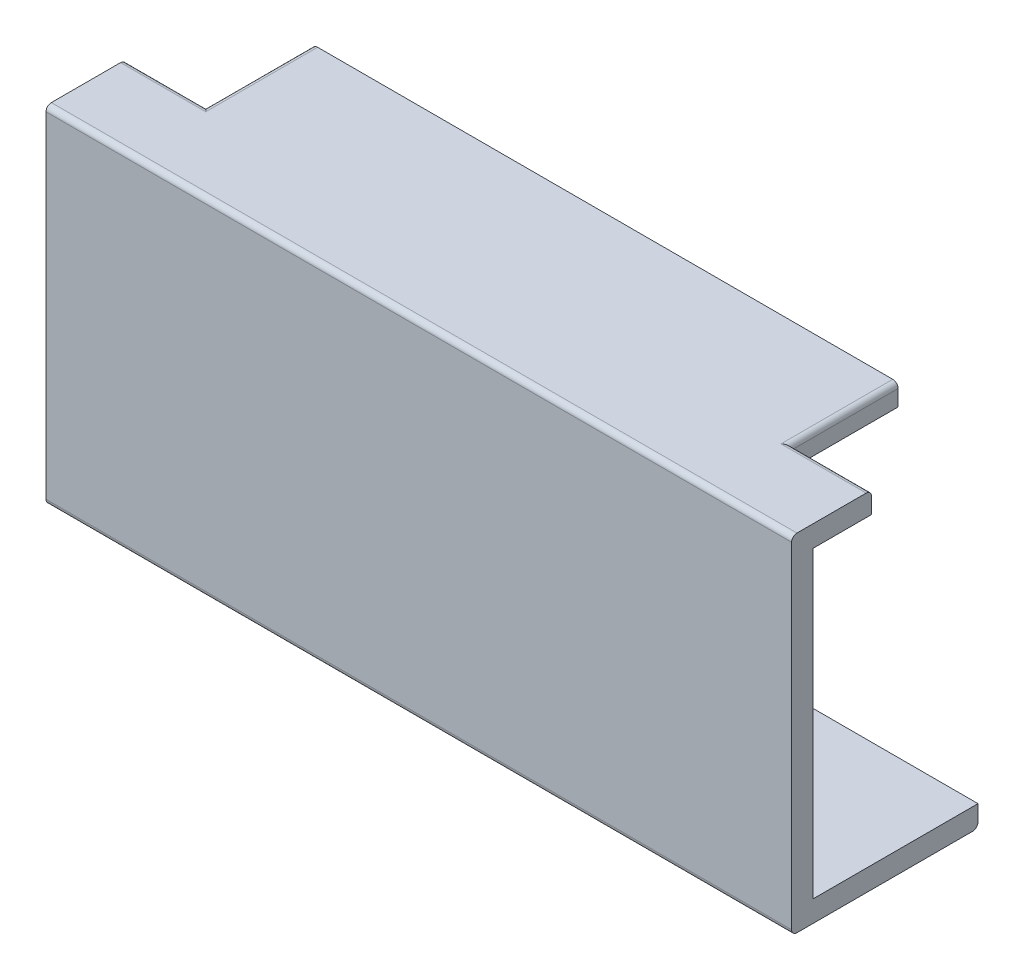
ISO-10303-21;
HEADER;
FILE_DESCRIPTION(('STEP AP214'),'2;1');
FILE_NAME('part.step','',(''),(''),'','','');
FILE_SCHEMA(('AUTOMOTIVE_DESIGN { 1 0 10303 214 1 1 1 1 }'));
ENDSEC;
DATA;
#1=APPLICATION_CONTEXT('core data for automotive mechanical design processes');
#2=APPLICATION_PROTOCOL_DEFINITION('international standard','automotive_design',2000,#1);
#3=PRODUCT_CONTEXT('',#1,'mechanical');
#4=PRODUCT('Part','Part','',(#3));
#5=PRODUCT_RELATED_PRODUCT_CATEGORY('part','',(#4));
#6=PRODUCT_DEFINITION_FORMATION('','',#4);
#7=PRODUCT_DEFINITION_CONTEXT('part definition',#1,'design');
#8=PRODUCT_DEFINITION('design','',#6,#7);
#9=PRODUCT_DEFINITION_SHAPE('','',#8);
#10=(LENGTH_UNIT() NAMED_UNIT(*) SI_UNIT(.MILLI.,.METRE.));
#11=(NAMED_UNIT(*) PLANE_ANGLE_UNIT() SI_UNIT($,.RADIAN.));
#12=(NAMED_UNIT(*) SI_UNIT($,.STERADIAN.) SOLID_ANGLE_UNIT());
#13=UNCERTAINTY_MEASURE_WITH_UNIT(LENGTH_MEASURE(1.E-05),#10,'distance_accuracy_value','');
#14=(GEOMETRIC_REPRESENTATION_CONTEXT(3) GLOBAL_UNCERTAINTY_ASSIGNED_CONTEXT((#13)) GLOBAL_UNIT_ASSIGNED_CONTEXT((#10,
#11,#12)) REPRESENTATION_CONTEXT('',''));
#15=CARTESIAN_POINT('',(0.,0.,0.));
#16=DIRECTION('',(0.,0.,1.));
#17=DIRECTION('',(1.,0.,0.));
#18=AXIS2_PLACEMENT_3D('',#15,#16,#17);
#19=CARTESIAN_POINT('',(-7.304,3.6256,2.274));
#20=DIRECTION('',(0.,-1.,0.));
#21=DIRECTION('',(1.,0.,0.));
#22=AXIS2_PLACEMENT_3D('',#19,#20,#21);
#23=PLANE('',#22);
#24=DIRECTION('',(0.,0.,-1.));
#25=VECTOR('',#24,1.);
#26=CARTESIAN_POINT('',(-5.904,3.6256,2.274));
#27=LINE('',#26,#25);
#28=CARTESIAN_POINT('',(-5.904,3.6256,2.614));
#29=VERTEX_POINT('',#28);
#30=CARTESIAN_POINT('',(-5.904,3.6256,2.484));
#31=VERTEX_POINT('',#30);
#32=EDGE_CURVE('E11',#29,#31,#27,.T.);
#33=ORIENTED_EDGE('',*,*,#32,.T.);
#34=DIRECTION('',(-1.,0.,0.));
#35=VECTOR('',#34,1.);
#36=CARTESIAN_POINT('',(-7.304,3.6256,2.484));
#37=LINE('',#36,#35);
#38=CARTESIAN_POINT('',(-6.064,3.6256,2.484));
#39=VERTEX_POINT('',#38);
#40=EDGE_CURVE('E24',#31,#39,#37,.T.);
#41=ORIENTED_EDGE('',*,*,#40,.T.);
#42=DIRECTION('',(0.,0.,-1.));
#43=VECTOR('',#42,1.);
#44=CARTESIAN_POINT('',(-6.064,3.6256,2.274));
#45=LINE('',#44,#43);
#46=CARTESIAN_POINT('',(-6.064,3.6256,2.274));
#47=VERTEX_POINT('',#46);
#48=EDGE_CURVE('E296',#39,#47,#45,.T.);
#49=ORIENTED_EDGE('',*,*,#48,.T.);
#50=DIRECTION('',(1.,0.,0.));
#51=VECTOR('',#50,1.);
#52=CARTESIAN_POINT('',(-7.304,3.6256,2.274));
#53=LINE('',#52,#51);
#54=CARTESIAN_POINT('',(-7.144,3.6256,2.274));
#55=VERTEX_POINT('',#54);
#56=EDGE_CURVE('E293',#55,#47,#53,.T.);
#57=ORIENTED_EDGE('',*,*,#56,.F.);
#58=DIRECTION('',(0.,0.,1.));
#59=VECTOR('',#58,1.);
#60=CARTESIAN_POINT('',(-7.144,3.6256,2.274));
#61=LINE('',#60,#59);
#62=CARTESIAN_POINT('',(-7.144,3.6256,2.484));
#63=VERTEX_POINT('',#62);
#64=EDGE_CURVE('E291',#55,#63,#61,.T.);
#65=ORIENTED_EDGE('',*,*,#64,.T.);
#66=DIRECTION('',(-1.,0.,0.));
#67=VECTOR('',#66,1.);
#68=CARTESIAN_POINT('',(-7.304,3.6256,2.484));
#69=LINE('',#68,#67);
#70=CARTESIAN_POINT('',(-7.304,3.6256,2.484));
#71=VERTEX_POINT('',#70);
#72=EDGE_CURVE('E173',#63,#71,#69,.T.);
#73=ORIENTED_EDGE('',*,*,#72,.T.);
#74=DIRECTION('',(0.,0.,-1.));
#75=VECTOR('',#74,1.);
#76=CARTESIAN_POINT('',(-7.304,3.6256,2.274));
#77=LINE('',#76,#75);
#78=CARTESIAN_POINT('',(-7.304,3.6256,2.614));
#79=VERTEX_POINT('',#78);
#80=EDGE_CURVE('E287',#79,#71,#77,.T.);
#81=ORIENTED_EDGE('',*,*,#80,.F.);
#82=DIRECTION('',(1.,0.,0.));
#83=VECTOR('',#82,1.);
#84=CARTESIAN_POINT('',(-7.304,3.6256,2.614));
#85=LINE('',#84,#83);
#86=EDGE_CURVE('E285',#79,#29,#85,.T.);
#87=ORIENTED_EDGE('',*,*,#86,.T.);
#88=EDGE_LOOP('',(#33,#41,#49,#57,#65,#73,#81,#87));
#89=FACE_BOUND('',#88,.T.);
#90=ADVANCED_FACE('F17',(#89),#23,.F.);
#91=CARTESIAN_POINT('',(-7.304,3.6256,2.274));
#92=DIRECTION('',(0.,0.,1.));
#93=DIRECTION('',(1.,0.,0.));
#94=AXIS2_PLACEMENT_3D('',#91,#92,#93);
#95=PLANE('',#94);
#96=ORIENTED_EDGE('',*,*,#56,.T.);
#97=CARTESIAN_POINT('',(-6.064,3.6156,2.274));
#98=DIRECTION('',(0.,0.,-1.));
#99=DIRECTION('',(1.,0.,0.));
#100=AXIS2_PLACEMENT_3D('',#97,#98,#99);
#101=CIRCLE('',#100,0.00999999999999959);
#102=CARTESIAN_POINT('',(-6.054,3.6156,2.274));
#103=VERTEX_POINT('',#102);
#104=EDGE_CURVE('E283',#47,#103,#101,.T.);
#105=ORIENTED_EDGE('',*,*,#104,.T.);
#106=DIRECTION('',(0.,-1.,0.));
#107=VECTOR('',#106,1.);
#108=CARTESIAN_POINT('',(-6.054,3.6256,2.274));
#109=LINE('',#108,#107);
#110=CARTESIAN_POINT('',(-6.054,3.5856,2.274));
#111=VERTEX_POINT('',#110);
#112=EDGE_CURVE('E281',#103,#111,#109,.T.);
#113=ORIENTED_EDGE('',*,*,#112,.T.);
#114=DIRECTION('',(1.,0.,0.));
#115=VECTOR('',#114,1.);
#116=CARTESIAN_POINT('',(-7.304,3.5856,2.274));
#117=LINE('',#116,#115);
#118=CARTESIAN_POINT('',(-7.154,3.5856,2.274));
#119=VERTEX_POINT('',#118);
#120=EDGE_CURVE('E278',#119,#111,#117,.T.);
#121=ORIENTED_EDGE('',*,*,#120,.F.);
#122=DIRECTION('',(0.,1.,0.));
#123=VECTOR('',#122,1.);
#124=CARTESIAN_POINT('',(-7.154,3.6256,2.274));
#125=LINE('',#124,#123);
#126=CARTESIAN_POINT('',(-7.154,3.6156,2.274));
#127=VERTEX_POINT('',#126);
#128=EDGE_CURVE('E276',#119,#127,#125,.T.);
#129=ORIENTED_EDGE('',*,*,#128,.T.);
#130=CARTESIAN_POINT('',(-7.144,3.6156,2.274));
#131=DIRECTION('',(0.,0.,-1.));
#132=DIRECTION('',(1.,0.,0.));
#133=AXIS2_PLACEMENT_3D('',#130,#131,#132);
#134=CIRCLE('',#133,0.00999999999999959);
#135=EDGE_CURVE('E159',#127,#55,#134,.T.);
#136=ORIENTED_EDGE('',*,*,#135,.T.);
#137=EDGE_LOOP('',(#96,#105,#113,#121,#129,#136));
#138=FACE_BOUND('',#137,.T.);
#139=ADVANCED_FACE('F317',(#138),#95,.F.);
#140=CARTESIAN_POINT('',(-7.304,3.5856,2.584));
#141=DIRECTION('',(0.,1.,0.));
#142=DIRECTION('',(0.,0.,-1.));
#143=AXIS2_PLACEMENT_3D('',#140,#141,#142);
#144=PLANE('',#143);
#145=DIRECTION('',(0.,0.,1.));
#146=VECTOR('',#145,1.);
#147=CARTESIAN_POINT('',(-6.054,3.5856,0.573999999999972));
#148=LINE('',#147,#146);
#149=CARTESIAN_POINT('',(-6.054,3.5856,2.474));
#150=VERTEX_POINT('',#149);
#151=EDGE_CURVE('E273',#111,#150,#148,.T.);
#152=ORIENTED_EDGE('',*,*,#151,.T.);
#153=DIRECTION('',(1.,0.,0.));
#154=VECTOR('',#153,1.);
#155=CARTESIAN_POINT('',(-5.904,3.5856,2.474));
#156=LINE('',#155,#154);
#157=CARTESIAN_POINT('',(-5.904,3.5856,2.474));
#158=VERTEX_POINT('',#157);
#159=EDGE_CURVE('E271',#150,#158,#156,.T.);
#160=ORIENTED_EDGE('',*,*,#159,.T.);
#161=DIRECTION('',(0.,0.,1.));
#162=VECTOR('',#161,1.);
#163=CARTESIAN_POINT('',(-5.904,3.5856,2.584));
#164=LINE('',#163,#162);
#165=CARTESIAN_POINT('',(-5.904,3.5856,2.584));
#166=VERTEX_POINT('',#165);
#167=EDGE_CURVE('E269',#158,#166,#164,.T.);
#168=ORIENTED_EDGE('',*,*,#167,.T.);
#169=DIRECTION('',(1.,0.,0.));
#170=VECTOR('',#169,1.);
#171=CARTESIAN_POINT('',(-7.304,3.5856,2.584));
#172=LINE('',#171,#170);
#173=CARTESIAN_POINT('',(-7.304,3.5856,2.584));
#174=VERTEX_POINT('',#173);
#175=EDGE_CURVE('E266',#174,#166,#172,.T.);
#176=ORIENTED_EDGE('',*,*,#175,.F.);
#177=DIRECTION('',(0.,0.,1.));
#178=VECTOR('',#177,1.);
#179=CARTESIAN_POINT('',(-7.304,3.5856,2.584));
#180=LINE('',#179,#178);
#181=CARTESIAN_POINT('',(-7.304,3.5856,2.474));
#182=VERTEX_POINT('',#181);
#183=EDGE_CURVE('E263',#182,#174,#180,.T.);
#184=ORIENTED_EDGE('',*,*,#183,.F.);
#185=DIRECTION('',(1.,0.,0.));
#186=VECTOR('',#185,1.);
#187=CARTESIAN_POINT('',(-7.304,3.5856,2.474));
#188=LINE('',#187,#186);
#189=CARTESIAN_POINT('',(-7.154,3.5856,2.474));
#190=VERTEX_POINT('',#189);
#191=EDGE_CURVE('E261',#182,#190,#188,.T.);
#192=ORIENTED_EDGE('',*,*,#191,.T.);
#193=DIRECTION('',(0.,0.,-1.));
#194=VECTOR('',#193,1.);
#195=CARTESIAN_POINT('',(-7.154,3.5856,0.573999999999972));
#196=LINE('',#195,#194);
#197=EDGE_CURVE('E145',#190,#119,#196,.T.);
#198=ORIENTED_EDGE('',*,*,#197,.T.);
#199=ORIENTED_EDGE('',*,*,#120,.T.);
#200=EDGE_LOOP('',(#152,#160,#168,#176,#184,#192,#198,#199));
#201=FACE_BOUND('',#200,.T.);
#202=ADVANCED_FACE('F319',(#201),#144,.F.);
#203=CARTESIAN_POINT('',(-7.304,3.5856,2.584));
#204=DIRECTION('',(0.,0.,1.));
#205=DIRECTION('',(1.,0.,0.));
#206=AXIS2_PLACEMENT_3D('',#203,#204,#205);
#207=PLANE('',#206);
#208=DIRECTION('',(0.,-1.,0.));
#209=VECTOR('',#208,1.);
#210=CARTESIAN_POINT('',(-5.904,3.5856,2.584));
#211=LINE('',#210,#209);
#212=CARTESIAN_POINT('',(-5.904,3.0156,2.584));
#213=VERTEX_POINT('',#212);
#214=EDGE_CURVE('E258',#166,#213,#211,.T.);
#215=ORIENTED_EDGE('',*,*,#214,.T.);
#216=DIRECTION('',(1.,0.,0.));
#217=VECTOR('',#216,1.);
#218=CARTESIAN_POINT('',(-7.304,3.0156,2.584));
#219=LINE('',#218,#217);
#220=CARTESIAN_POINT('',(-7.304,3.0156,2.584));
#221=VERTEX_POINT('',#220);
#222=EDGE_CURVE('E255',#221,#213,#219,.T.);
#223=ORIENTED_EDGE('',*,*,#222,.F.);
#224=DIRECTION('',(0.,-1.,0.));
#225=VECTOR('',#224,1.);
#226=CARTESIAN_POINT('',(-7.304,3.5856,2.584));
#227=LINE('',#226,#225);
#228=EDGE_CURVE('E252',#174,#221,#227,.T.);
#229=ORIENTED_EDGE('',*,*,#228,.F.);
#230=ORIENTED_EDGE('',*,*,#175,.T.);
#231=EDGE_LOOP('',(#215,#223,#229,#230));
#232=FACE_BOUND('',#231,.T.);
#233=ADVANCED_FACE('F358',(#232),#207,.F.);
#234=CARTESIAN_POINT('',(-7.304,3.0156,2.584));
#235=DIRECTION('',(0.,-1.,0.));
#236=DIRECTION('',(1.,0.,0.));
#237=AXIS2_PLACEMENT_3D('',#234,#235,#236);
#238=PLANE('',#237);
#239=DIRECTION('',(0.,0.,-1.));
#240=VECTOR('',#239,1.);
#241=CARTESIAN_POINT('',(-5.904,3.0156,2.584));
#242=LINE('',#241,#240);
#243=CARTESIAN_POINT('',(-5.904,3.0156,2.274));
#244=VERTEX_POINT('',#243);
#245=EDGE_CURVE('E250',#213,#244,#242,.T.);
#246=ORIENTED_EDGE('',*,*,#245,.T.);
#247=DIRECTION('',(1.,0.,0.));
#248=VECTOR('',#247,1.);
#249=CARTESIAN_POINT('',(-7.304,3.0156,2.274));
#250=LINE('',#249,#248);
#251=CARTESIAN_POINT('',(-7.304,3.0156,2.274));
#252=VERTEX_POINT('',#251);
#253=EDGE_CURVE('E247',#252,#244,#250,.T.);
#254=ORIENTED_EDGE('',*,*,#253,.F.);
#255=DIRECTION('',(0.,0.,-1.));
#256=VECTOR('',#255,1.);
#257=CARTESIAN_POINT('',(-7.304,3.0156,2.584));
#258=LINE('',#257,#256);
#259=EDGE_CURVE('E244',#221,#252,#258,.T.);
#260=ORIENTED_EDGE('',*,*,#259,.F.);
#261=ORIENTED_EDGE('',*,*,#222,.T.);
#262=EDGE_LOOP('',(#246,#254,#260,#261));
#263=FACE_BOUND('',#262,.T.);
#264=ADVANCED_FACE('F353',(#263),#238,.F.);
#265=CARTESIAN_POINT('',(-7.304,3.0156,2.274));
#266=DIRECTION('',(0.,0.,1.));
#267=DIRECTION('',(1.,0.,0.));
#268=AXIS2_PLACEMENT_3D('',#265,#266,#267);
#269=PLANE('',#268);
#270=DIRECTION('',(0.,-1.,0.));
#271=VECTOR('',#270,1.);
#272=CARTESIAN_POINT('',(-5.904,3.0156,2.274));
#273=LINE('',#272,#271);
#274=CARTESIAN_POINT('',(-5.904,2.9856,2.274));
#275=VERTEX_POINT('',#274);
#276=EDGE_CURVE('E242',#244,#275,#273,.T.);
#277=ORIENTED_EDGE('',*,*,#276,.T.);
#278=DIRECTION('',(-1.,0.,0.));
#279=VECTOR('',#278,1.);
#280=CARTESIAN_POINT('',(-7.304,2.9856,2.274));
#281=LINE('',#280,#279);
#282=CARTESIAN_POINT('',(-7.304,2.9856,2.274));
#283=VERTEX_POINT('',#282);
#284=EDGE_CURVE('E240',#275,#283,#281,.T.);
#285=ORIENTED_EDGE('',*,*,#284,.T.);
#286=DIRECTION('',(0.,-1.,0.));
#287=VECTOR('',#286,1.);
#288=CARTESIAN_POINT('',(-7.304,3.0156,2.274));
#289=LINE('',#288,#287);
#290=EDGE_CURVE('E237',#252,#283,#289,.T.);
#291=ORIENTED_EDGE('',*,*,#290,.F.);
#292=ORIENTED_EDGE('',*,*,#253,.T.);
#293=EDGE_LOOP('',(#277,#285,#291,#292));
#294=FACE_BOUND('',#293,.T.);
#295=ADVANCED_FACE('F350',(#294),#269,.F.);
#296=CARTESIAN_POINT('',(-7.304,2.9756,2.274));
#297=DIRECTION('',(0.,1.,0.));
#298=DIRECTION('',(0.,0.,-1.));
#299=AXIS2_PLACEMENT_3D('',#296,#297,#298);
#300=PLANE('',#299);
#301=DIRECTION('',(0.,0.,1.));
#302=VECTOR('',#301,1.);
#303=CARTESIAN_POINT('',(-7.304,2.9756,2.274));
#304=LINE('',#303,#302);
#305=CARTESIAN_POINT('',(-7.304,2.9756,2.284));
#306=VERTEX_POINT('',#305);
#307=CARTESIAN_POINT('',(-7.304,2.9756,2.614));
#308=VERTEX_POINT('',#307);
#309=EDGE_CURVE('E235',#306,#308,#304,.T.);
#310=ORIENTED_EDGE('',*,*,#309,.F.);
#311=DIRECTION('',(1.,0.,0.));
#312=VECTOR('',#311,1.);
#313=CARTESIAN_POINT('',(-7.304,2.9756,2.284));
#314=LINE('',#313,#312);
#315=CARTESIAN_POINT('',(-5.904,2.9756,2.284));
#316=VERTEX_POINT('',#315);
#317=EDGE_CURVE('E233',#306,#316,#314,.T.);
#318=ORIENTED_EDGE('',*,*,#317,.T.);
#319=DIRECTION('',(0.,0.,1.));
#320=VECTOR('',#319,1.);
#321=CARTESIAN_POINT('',(-5.904,2.9756,2.274));
#322=LINE('',#321,#320);
#323=CARTESIAN_POINT('',(-5.904,2.9756,2.614));
#324=VERTEX_POINT('',#323);
#325=EDGE_CURVE('E231',#316,#324,#322,.T.);
#326=ORIENTED_EDGE('',*,*,#325,.T.);
#327=DIRECTION('',(-1.,0.,0.));
#328=VECTOR('',#327,1.);
#329=CARTESIAN_POINT('',(-7.304,2.9756,2.614));
#330=LINE('',#329,#328);
#331=EDGE_CURVE('E228',#324,#308,#330,.T.);
#332=ORIENTED_EDGE('',*,*,#331,.T.);
#333=EDGE_LOOP('',(#310,#318,#326,#332));
#334=FACE_BOUND('',#333,.T.);
#335=ADVANCED_FACE('F340',(#334),#300,.F.);
#336=CARTESIAN_POINT('',(-7.304,2.9756,2.624));
#337=DIRECTION('',(0.,0.,-1.));
#338=DIRECTION('',(-1.,0.,0.));
#339=AXIS2_PLACEMENT_3D('',#336,#337,#338);
#340=PLANE('',#339);
#341=DIRECTION('',(0.,1.,0.));
#342=VECTOR('',#341,1.);
#343=CARTESIAN_POINT('',(-7.304,2.9756,2.624));
#344=LINE('',#343,#342);
#345=CARTESIAN_POINT('',(-7.304,2.9856,2.624));
#346=VERTEX_POINT('',#345);
#347=CARTESIAN_POINT('',(-7.304,3.6156,2.624));
#348=VERTEX_POINT('',#347);
#349=EDGE_CURVE('E226',#346,#348,#344,.T.);
#350=ORIENTED_EDGE('',*,*,#349,.F.);
#351=DIRECTION('',(1.,0.,0.));
#352=VECTOR('',#351,1.);
#353=CARTESIAN_POINT('',(-7.304,2.9856,2.624));
#354=LINE('',#353,#352);
#355=CARTESIAN_POINT('',(-5.904,2.9856,2.624));
#356=VERTEX_POINT('',#355);
#357=EDGE_CURVE('E224',#346,#356,#354,.T.);
#358=ORIENTED_EDGE('',*,*,#357,.T.);
#359=DIRECTION('',(0.,1.,0.));
#360=VECTOR('',#359,1.);
#361=CARTESIAN_POINT('',(-5.904,2.9756,2.624));
#362=LINE('',#361,#360);
#363=CARTESIAN_POINT('',(-5.904,3.6156,2.624));
#364=VERTEX_POINT('',#363);
#365=EDGE_CURVE('E222',#356,#364,#362,.T.);
#366=ORIENTED_EDGE('',*,*,#365,.T.);
#367=DIRECTION('',(-1.,0.,0.));
#368=VECTOR('',#367,1.);
#369=CARTESIAN_POINT('',(-7.304,3.6156,2.624));
#370=LINE('',#369,#368);
#371=EDGE_CURVE('E219',#364,#348,#370,.T.);
#372=ORIENTED_EDGE('',*,*,#371,.T.);
#373=EDGE_LOOP('',(#350,#358,#366,#372));
#374=FACE_BOUND('',#373,.T.);
#375=ADVANCED_FACE('F413',(#374),#340,.F.);
#376=CARTESIAN_POINT('',(-7.304,2.9756,1.524));
#377=DIRECTION('',(-1.,0.,0.));
#378=DIRECTION('',(0.,0.,1.));
#379=AXIS2_PLACEMENT_3D('',#376,#377,#378);
#380=PLANE('',#379);
#381=ORIENTED_EDGE('',*,*,#290,.T.);
#382=CARTESIAN_POINT('',(-7.304,2.9856,2.284));
#383=DIRECTION('',(-1.,0.,0.));
#384=DIRECTION('',(0.,0.,1.));
#385=AXIS2_PLACEMENT_3D('',#382,#383,#384);
#386=CIRCLE('',#385,0.01);
#387=EDGE_CURVE('E216',#283,#306,#386,.T.);
#388=ORIENTED_EDGE('',*,*,#387,.T.);
#389=ORIENTED_EDGE('',*,*,#309,.T.);
#390=CARTESIAN_POINT('',(-7.304,2.9856,2.614));
#391=DIRECTION('',(-1.,0.,0.));
#392=DIRECTION('',(0.,0.,1.));
#393=AXIS2_PLACEMENT_3D('',#390,#391,#392);
#394=CIRCLE('',#393,0.01);
#395=EDGE_CURVE('E213',#308,#346,#394,.T.);
#396=ORIENTED_EDGE('',*,*,#395,.T.);
#397=ORIENTED_EDGE('',*,*,#349,.T.);
#398=CARTESIAN_POINT('',(-7.304,3.6156,2.614));
#399=DIRECTION('',(-1.,0.,0.));
#400=DIRECTION('',(0.,0.,1.));
#401=AXIS2_PLACEMENT_3D('',#398,#399,#400);
#402=CIRCLE('',#401,0.01);
#403=EDGE_CURVE('E210',#348,#79,#402,.T.);
#404=ORIENTED_EDGE('',*,*,#403,.T.);
#405=ORIENTED_EDGE('',*,*,#80,.T.);
#406=CARTESIAN_POINT('',(-7.304,3.6156,2.484));
#407=DIRECTION('',(-1.,0.,0.));
#408=DIRECTION('',(0.,0.,1.));
#409=AXIS2_PLACEMENT_3D('',#406,#407,#408);
#410=CIRCLE('',#409,0.01);
#411=CARTESIAN_POINT('',(-7.304,3.6156,2.474));
#412=VERTEX_POINT('',#411);
#413=EDGE_CURVE('E208',#71,#412,#410,.T.);
#414=ORIENTED_EDGE('',*,*,#413,.T.);
#415=DIRECTION('',(0.,1.,0.));
#416=VECTOR('',#415,1.);
#417=CARTESIAN_POINT('',(-7.304,3.5856,2.474));
#418=LINE('',#417,#416);
#419=EDGE_CURVE('E166',#182,#412,#418,.T.);
#420=ORIENTED_EDGE('',*,*,#419,.F.);
#421=ORIENTED_EDGE('',*,*,#183,.T.);
#422=ORIENTED_EDGE('',*,*,#228,.T.);
#423=ORIENTED_EDGE('',*,*,#259,.T.);
#424=EDGE_LOOP('',(#381,#388,#389,#396,#397,#404,#405,#414,#420,#421,#422,#423));
#425=FACE_BOUND('',#424,.T.);
#426=ADVANCED_FACE('F321',(#425),#380,.T.);
#427=CARTESIAN_POINT('',(-5.904,2.9756,1.524));
#428=DIRECTION('',(-1.,0.,0.));
#429=DIRECTION('',(0.,0.,1.));
#430=AXIS2_PLACEMENT_3D('',#427,#428,#429);
#431=PLANE('',#430);
#432=ORIENTED_EDGE('',*,*,#325,.F.);
#433=CARTESIAN_POINT('',(-5.904,2.9856,2.284));
#434=DIRECTION('',(1.,0.,0.));
#435=DIRECTION('',(0.,0.,1.));
#436=AXIS2_PLACEMENT_3D('',#433,#434,#435);
#437=CIRCLE('',#436,0.01);
#438=EDGE_CURVE('E204',#316,#275,#437,.T.);
#439=ORIENTED_EDGE('',*,*,#438,.T.);
#440=ORIENTED_EDGE('',*,*,#276,.F.);
#441=ORIENTED_EDGE('',*,*,#245,.F.);
#442=ORIENTED_EDGE('',*,*,#214,.F.);
#443=ORIENTED_EDGE('',*,*,#167,.F.);
#444=DIRECTION('',(0.,1.,0.));
#445=VECTOR('',#444,1.);
#446=CARTESIAN_POINT('',(-5.904,3.5856,2.474));
#447=LINE('',#446,#445);
#448=CARTESIAN_POINT('',(-5.904,3.6156,2.474));
#449=VERTEX_POINT('',#448);
#450=EDGE_CURVE('E202',#158,#449,#447,.T.);
#451=ORIENTED_EDGE('',*,*,#450,.T.);
#452=CARTESIAN_POINT('',(-5.904,3.6156,2.484));
#453=DIRECTION('',(1.,0.,0.));
#454=DIRECTION('',(0.,0.,1.));
#455=AXIS2_PLACEMENT_3D('',#452,#453,#454);
#456=CIRCLE('',#455,0.01);
#457=EDGE_CURVE('E200',#449,#31,#456,.T.);
#458=ORIENTED_EDGE('',*,*,#457,.T.);
#459=ORIENTED_EDGE('',*,*,#32,.F.);
#460=CARTESIAN_POINT('',(-5.904,3.6156,2.614));
#461=DIRECTION('',(1.,0.,0.));
#462=DIRECTION('',(0.,0.,1.));
#463=AXIS2_PLACEMENT_3D('',#460,#461,#462);
#464=CIRCLE('',#463,0.01);
#465=EDGE_CURVE('E198',#29,#364,#464,.T.);
#466=ORIENTED_EDGE('',*,*,#465,.T.);
#467=ORIENTED_EDGE('',*,*,#365,.F.);
#468=CARTESIAN_POINT('',(-5.904,2.9856,2.614));
#469=DIRECTION('',(1.,0.,0.));
#470=DIRECTION('',(0.,0.,1.));
#471=AXIS2_PLACEMENT_3D('',#468,#469,#470);
#472=CIRCLE('',#471,0.01);
#473=EDGE_CURVE('E195',#356,#324,#472,.T.);
#474=ORIENTED_EDGE('',*,*,#473,.T.);
#475=EDGE_LOOP('',(#432,#439,#440,#441,#442,#443,#451,#458,#459,#466,#467,#474));
#476=FACE_BOUND('',#475,.T.);
#477=ADVANCED_FACE('F331',(#476),#431,.F.);
#478=CARTESIAN_POINT('',(-6.054,3.5856,0.573999999999972));
#479=DIRECTION('',(-1.,0.,0.));
#480=DIRECTION('',(0.,0.,1.));
#481=AXIS2_PLACEMENT_3D('',#478,#479,#480);
#482=PLANE('',#481);
#483=ORIENTED_EDGE('',*,*,#112,.F.);
#484=DIRECTION('',(0.,0.,1.));
#485=VECTOR('',#484,1.);
#486=CARTESIAN_POINT('',(-6.054,3.6156,0.573999999999972));
#487=LINE('',#486,#485);
#488=CARTESIAN_POINT('',(-6.054,3.6156,2.474));
#489=VERTEX_POINT('',#488);
#490=EDGE_CURVE('E193',#103,#489,#487,.T.);
#491=ORIENTED_EDGE('',*,*,#490,.T.);
#492=DIRECTION('',(0.,1.,0.));
#493=VECTOR('',#492,1.);
#494=CARTESIAN_POINT('',(-6.054,3.5856,2.474));
#495=LINE('',#494,#493);
#496=EDGE_CURVE('E190',#150,#489,#495,.T.);
#497=ORIENTED_EDGE('',*,*,#496,.F.);
#498=ORIENTED_EDGE('',*,*,#151,.F.);
#499=EDGE_LOOP('',(#483,#491,#497,#498));
#500=FACE_BOUND('',#499,.T.);
#501=ADVANCED_FACE('F315',(#500),#482,.F.);
#502=CARTESIAN_POINT('',(-5.904,3.5856,2.474));
#503=DIRECTION('',(0.,0.,1.));
#504=DIRECTION('',(1.,0.,0.));
#505=AXIS2_PLACEMENT_3D('',#502,#503,#504);
#506=PLANE('',#505);
#507=ORIENTED_EDGE('',*,*,#496,.T.);
#508=DIRECTION('',(1.,0.,0.));
#509=VECTOR('',#508,1.);
#510=CARTESIAN_POINT('',(-5.904,3.6156,2.474));
#511=LINE('',#510,#509);
#512=EDGE_CURVE('E149',#489,#449,#511,.T.);
#513=ORIENTED_EDGE('',*,*,#512,.T.);
#514=ORIENTED_EDGE('',*,*,#450,.F.);
#515=ORIENTED_EDGE('',*,*,#159,.F.);
#516=EDGE_LOOP('',(#507,#513,#514,#515));
#517=FACE_BOUND('',#516,.T.);
#518=ADVANCED_FACE('F309',(#517),#506,.F.);
#519=CARTESIAN_POINT('',(-7.154,3.5856,0.573999999999972));
#520=DIRECTION('',(1.,0.,0.));
#521=DIRECTION('',(0.,0.,-1.));
#522=AXIS2_PLACEMENT_3D('',#519,#520,#521);
#523=PLANE('',#522);
#524=DIRECTION('',(0.,1.,0.));
#525=VECTOR('',#524,1.);
#526=CARTESIAN_POINT('',(-7.154,3.5856,2.474));
#527=LINE('',#526,#525);
#528=CARTESIAN_POINT('',(-7.154,3.6156,2.474));
#529=VERTEX_POINT('',#528);
#530=EDGE_CURVE('E139',#190,#529,#527,.T.);
#531=ORIENTED_EDGE('',*,*,#530,.T.);
#532=DIRECTION('',(0.,0.,-1.));
#533=VECTOR('',#532,1.);
#534=CARTESIAN_POINT('',(-7.154,3.6156,0.573999999999972));
#535=LINE('',#534,#533);
#536=EDGE_CURVE('E143',#529,#127,#535,.T.);
#537=ORIENTED_EDGE('',*,*,#536,.T.);
#538=ORIENTED_EDGE('',*,*,#128,.F.);
#539=ORIENTED_EDGE('',*,*,#197,.F.);
#540=EDGE_LOOP('',(#531,#537,#538,#539));
#541=FACE_BOUND('',#540,.T.);
#542=ADVANCED_FACE('F141',(#541),#523,.F.);
#543=CARTESIAN_POINT('',(-7.304,3.5856,2.474));
#544=DIRECTION('',(0.,0.,1.));
#545=DIRECTION('',(1.,0.,0.));
#546=AXIS2_PLACEMENT_3D('',#543,#544,#545);
#547=PLANE('',#546);
#548=ORIENTED_EDGE('',*,*,#419,.T.);
#549=DIRECTION('',(1.,0.,0.));
#550=VECTOR('',#549,1.);
#551=CARTESIAN_POINT('',(-7.304,3.6156,2.474));
#552=LINE('',#551,#550);
#553=EDGE_CURVE('E160',#412,#529,#552,.T.);
#554=ORIENTED_EDGE('',*,*,#553,.T.);
#555=ORIENTED_EDGE('',*,*,#530,.F.);
#556=ORIENTED_EDGE('',*,*,#191,.F.);
#557=EDGE_LOOP('',(#548,#554,#555,#556));
#558=FACE_BOUND('',#557,.T.);
#559=ADVANCED_FACE('F164',(#558),#547,.F.);
#560=CARTESIAN_POINT('',(-7.304,2.9856,2.284));
#561=DIRECTION('',(1.,0.,0.));
#562=DIRECTION('',(0.,0.,-1.));
#563=AXIS2_PLACEMENT_3D('',#560,#561,#562);
#564=CYLINDRICAL_SURFACE('',#563,0.01);
#565=ORIENTED_EDGE('',*,*,#387,.F.);
#566=ORIENTED_EDGE('',*,*,#284,.F.);
#567=ORIENTED_EDGE('',*,*,#438,.F.);
#568=ORIENTED_EDGE('',*,*,#317,.F.);
#569=EDGE_LOOP('',(#565,#566,#567,#568));
#570=FACE_BOUND('',#569,.T.);
#571=ADVANCED_FACE('F347',(#570),#564,.T.);
#572=CARTESIAN_POINT('',(-7.304,2.9856,2.614));
#573=DIRECTION('',(1.,0.,0.));
#574=DIRECTION('',(0.,0.,-1.));
#575=AXIS2_PLACEMENT_3D('',#572,#573,#574);
#576=CYLINDRICAL_SURFACE('',#575,0.01);
#577=ORIENTED_EDGE('',*,*,#395,.F.);
#578=ORIENTED_EDGE('',*,*,#331,.F.);
#579=ORIENTED_EDGE('',*,*,#473,.F.);
#580=ORIENTED_EDGE('',*,*,#357,.F.);
#581=EDGE_LOOP('',(#577,#578,#579,#580));
#582=FACE_BOUND('',#581,.T.);
#583=ADVANCED_FACE('F338',(#582),#576,.T.);
#584=CARTESIAN_POINT('',(-6.064,3.6156,0.573999999999972));
#585=DIRECTION('',(0.,0.,1.));
#586=DIRECTION('',(1.,0.,0.));
#587=AXIS2_PLACEMENT_3D('',#584,#585,#586);
#588=CYLINDRICAL_SURFACE('',#587,0.00999999999999959);
#589=ORIENTED_EDGE('',*,*,#104,.F.);
#590=ORIENTED_EDGE('',*,*,#48,.F.);
#591=CARTESIAN_POINT('',(-6.054,3.6156,2.474));
#592=CARTESIAN_POINT('',(-6.05399999999999,3.62145786437631,2.47400000000003));
#593=CARTESIAN_POINT('',(-6.05814213562368,3.6256,2.47814213562372));
#594=CARTESIAN_POINT('',(-6.064,3.6256,2.484));
#595=(BOUNDED_CURVE() B_SPLINE_CURVE(3,(#591,#592,#593,#594),.UNSPECIFIED.,.F.,
.F.) B_SPLINE_CURVE_WITH_KNOTS((4,4),(0.,1.5707963267949),
.UNSPECIFIED.) CURVE() GEOMETRIC_REPRESENTATION_ITEM() RATIONAL_B_SPLINE_CURVE((1.,
0.804737854124365,0.804737854124365,1.)) REPRESENTATION_ITEM(''));
#596=EDGE_CURVE('E169',#489,#39,#595,.T.);
#597=ORIENTED_EDGE('',*,*,#596,.F.);
#598=ORIENTED_EDGE('',*,*,#490,.F.);
#599=EDGE_LOOP('',(#589,#590,#597,#598));
#600=FACE_BOUND('',#599,.T.);
#601=ADVANCED_FACE('F303',(#600),#588,.T.);
#602=CARTESIAN_POINT('',(-5.904,3.6156,2.484));
#603=DIRECTION('',(1.,0.,0.));
#604=DIRECTION('',(0.,0.,-1.));
#605=AXIS2_PLACEMENT_3D('',#602,#603,#604);
#606=CYLINDRICAL_SURFACE('',#605,0.01);
#607=ORIENTED_EDGE('',*,*,#596,.T.);
#608=ORIENTED_EDGE('',*,*,#40,.F.);
#609=ORIENTED_EDGE('',*,*,#457,.F.);
#610=ORIENTED_EDGE('',*,*,#512,.F.);
#611=EDGE_LOOP('',(#607,#608,#609,#610));
#612=FACE_BOUND('',#611,.T.);
#613=ADVANCED_FACE('F306',(#612),#606,.T.);
#614=CARTESIAN_POINT('',(-7.304,3.6156,2.484));
#615=DIRECTION('',(1.,0.,0.));
#616=DIRECTION('',(0.,0.,-1.));
#617=AXIS2_PLACEMENT_3D('',#614,#615,#616);
#618=CYLINDRICAL_SURFACE('',#617,0.01);
#619=ORIENTED_EDGE('',*,*,#413,.F.);
#620=ORIENTED_EDGE('',*,*,#72,.F.);
#621=CARTESIAN_POINT('',(-7.154,3.6156,2.474));
#622=CARTESIAN_POINT('',(-7.15400000000004,3.62145786437621,2.47399999999992));
#623=CARTESIAN_POINT('',(-7.14985786437622,3.62560000000003,2.47814213562373));
#624=CARTESIAN_POINT('',(-7.144,3.6256,2.484));
#625=(BOUNDED_CURVE() B_SPLINE_CURVE(3,(#621,#622,#623,#624),.UNSPECIFIED.,.F.,
.F.) B_SPLINE_CURVE_WITH_KNOTS((4,4),(0.,1.57079632679492),
.UNSPECIFIED.) CURVE() GEOMETRIC_REPRESENTATION_ITEM() RATIONAL_B_SPLINE_CURVE((1.,
0.80473785412436,0.80473785412436,1.)) REPRESENTATION_ITEM(''));
#626=EDGE_CURVE('E157',#529,#63,#625,.T.);
#627=ORIENTED_EDGE('',*,*,#626,.F.);
#628=ORIENTED_EDGE('',*,*,#553,.F.);
#629=EDGE_LOOP('',(#619,#620,#627,#628));
#630=FACE_BOUND('',#629,.T.);
#631=ADVANCED_FACE('F172',(#630),#618,.T.);
#632=CARTESIAN_POINT('',(-7.144,3.6156,0.573999999999972));
#633=DIRECTION('',(0.,0.,-1.));
#634=DIRECTION('',(-1.,0.,0.));
#635=AXIS2_PLACEMENT_3D('',#632,#633,#634);
#636=CYLINDRICAL_SURFACE('',#635,0.00999999999999959);
#637=ORIENTED_EDGE('',*,*,#626,.T.);
#638=ORIENTED_EDGE('',*,*,#64,.F.);
#639=ORIENTED_EDGE('',*,*,#135,.F.);
#640=ORIENTED_EDGE('',*,*,#536,.F.);
#641=EDGE_LOOP('',(#637,#638,#639,#640));
#642=FACE_BOUND('',#641,.T.);
#643=ADVANCED_FACE('F154',(#642),#636,.T.);
#644=CARTESIAN_POINT('',(-7.304,3.6156,2.614));
#645=DIRECTION('',(1.,0.,0.));
#646=DIRECTION('',(0.,0.,-1.));
#647=AXIS2_PLACEMENT_3D('',#644,#645,#646);
#648=CYLINDRICAL_SURFACE('',#647,0.01);
#649=ORIENTED_EDGE('',*,*,#403,.F.);
#650=ORIENTED_EDGE('',*,*,#371,.F.);
#651=ORIENTED_EDGE('',*,*,#465,.F.);
#652=ORIENTED_EDGE('',*,*,#86,.F.);
#653=EDGE_LOOP('',(#649,#650,#651,#652));
#654=FACE_BOUND('',#653,.T.);
#655=ADVANCED_FACE('F327',(#654),#648,.T.);
#656=CLOSED_SHELL('',(#90,#139,#202,#233,#264,#295,#335,#375,#426,#477,#501,#518,#542,#559,#571,
#583,#601,#613,#631,#643,#655));
#657=MANIFOLD_SOLID_BREP('B1',#656);
#658=ADVANCED_BREP_SHAPE_REPRESENTATION('',(#18,#657),#14);
#659=SHAPE_DEFINITION_REPRESENTATION(#9,#658);
ENDSEC;
END-ISO-10303-21;
